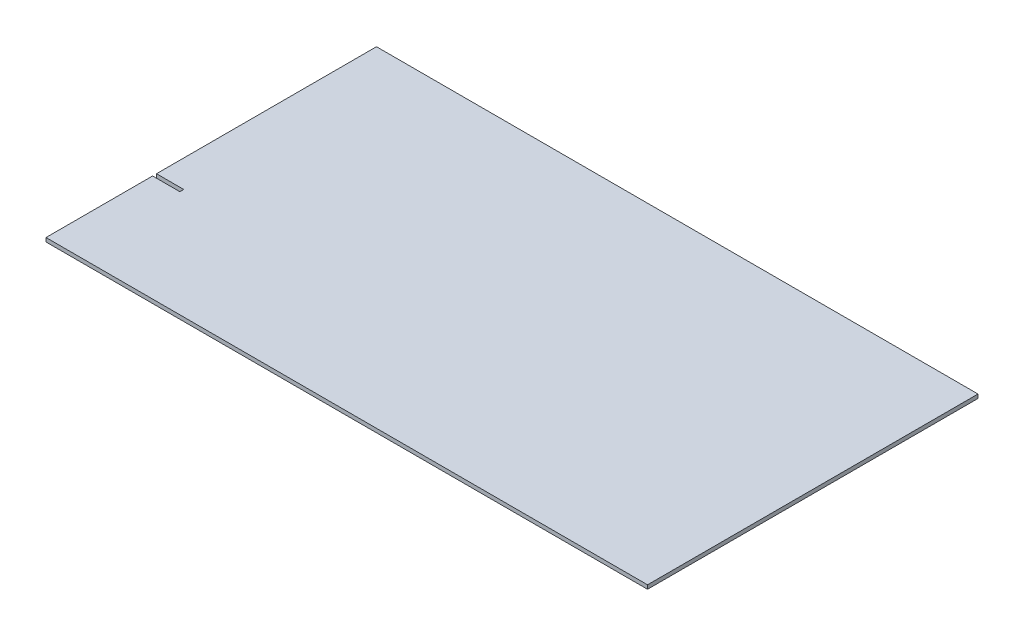
ISO-10303-21;
HEADER;
FILE_DESCRIPTION(('STEP AP214'),'2;1');
FILE_NAME('part.step','',(''),(''),'','','');
FILE_SCHEMA(('AUTOMOTIVE_DESIGN { 1 0 10303 214 1 1 1 1 }'));
ENDSEC;
DATA;
#1=APPLICATION_CONTEXT('core data for automotive mechanical design processes');
#2=APPLICATION_PROTOCOL_DEFINITION('international standard','automotive_design',2000,#1);
#3=PRODUCT_CONTEXT('',#1,'mechanical');
#4=PRODUCT('Part','Part','',(#3));
#5=PRODUCT_RELATED_PRODUCT_CATEGORY('part','',(#4));
#6=PRODUCT_DEFINITION_FORMATION('','',#4);
#7=PRODUCT_DEFINITION_CONTEXT('part definition',#1,'design');
#8=PRODUCT_DEFINITION('design','',#6,#7);
#9=PRODUCT_DEFINITION_SHAPE('','',#8);
#10=(LENGTH_UNIT() NAMED_UNIT(*) SI_UNIT(.MILLI.,.METRE.));
#11=(NAMED_UNIT(*) PLANE_ANGLE_UNIT() SI_UNIT($,.RADIAN.));
#12=(NAMED_UNIT(*) SI_UNIT($,.STERADIAN.) SOLID_ANGLE_UNIT());
#13=UNCERTAINTY_MEASURE_WITH_UNIT(LENGTH_MEASURE(1.E-05),#10,'distance_accuracy_value','');
#14=(GEOMETRIC_REPRESENTATION_CONTEXT(3) GLOBAL_UNCERTAINTY_ASSIGNED_CONTEXT((#13)) GLOBAL_UNIT_ASSIGNED_CONTEXT((#10,
#11,#12)) REPRESENTATION_CONTEXT('',''));
#15=CARTESIAN_POINT('',(0.,0.,0.));
#16=DIRECTION('',(0.,0.,1.));
#17=DIRECTION('',(1.,0.,0.));
#18=AXIS2_PLACEMENT_3D('',#15,#16,#17);
#19=CARTESIAN_POINT('',(0.,2.,0.));
#20=DIRECTION('',(1.,0.,0.));
#21=DIRECTION('',(0.,0.,-1.));
#22=AXIS2_PLACEMENT_3D('',#19,#20,#21);
#23=PLANE('',#22);
#24=DIRECTION('',(0.,0.,1.));
#25=VECTOR('',#24,1.);
#26=CARTESIAN_POINT('',(0.,0.,0.));
#27=LINE('',#26,#25);
#28=CARTESIAN_POINT('',(0.,0.,-169.76));
#29=VERTEX_POINT('',#28);
#30=CARTESIAN_POINT('',(0.,0.,-56.76));
#31=VERTEX_POINT('',#30);
#32=EDGE_CURVE('E135',#29,#31,#27,.T.);
#33=ORIENTED_EDGE('',*,*,#32,.T.);
#34=DIRECTION('',(0.,1.,0.));
#35=VECTOR('',#34,1.);
#36=CARTESIAN_POINT('',(0.,-8.,-56.76));
#37=LINE('',#36,#35);
#38=CARTESIAN_POINT('',(0.,2.,-56.76));
#39=VERTEX_POINT('',#38);
#40=EDGE_CURVE('E159',#31,#39,#37,.T.);
#41=ORIENTED_EDGE('',*,*,#40,.T.);
#42=DIRECTION('',(0.,0.,1.));
#43=VECTOR('',#42,1.);
#44=CARTESIAN_POINT('',(0.,2.,0.));
#45=LINE('',#44,#43);
#46=CARTESIAN_POINT('',(0.,2.,-169.76));
#47=VERTEX_POINT('',#46);
#48=EDGE_CURVE('E123',#47,#39,#45,.T.);
#49=ORIENTED_EDGE('',*,*,#48,.F.);
#50=DIRECTION('',(0.,-1.,0.));
#51=VECTOR('',#50,1.);
#52=CARTESIAN_POINT('',(0.,2.,-169.76));
#53=LINE('',#52,#51);
#54=EDGE_CURVE('E134',#47,#29,#53,.T.);
#55=ORIENTED_EDGE('',*,*,#54,.T.);
#56=EDGE_LOOP('',(#33,#41,#49,#55));
#57=FACE_BOUND('',#56,.T.);
#58=ADVANCED_FACE('F33',(#57),#23,.F.);
#59=CARTESIAN_POINT('',(0.,2.,-54.76));
#60=VERTEX_POINT('',#59);
#61=CARTESIAN_POINT('',(0.,2.,0.));
#62=VERTEX_POINT('',#61);
#63=EDGE_CURVE('E85',#60,#62,#45,.T.);
#64=ORIENTED_EDGE('',*,*,#63,.F.);
#65=DIRECTION('',(0.,1.,0.));
#66=VECTOR('',#65,1.);
#67=CARTESIAN_POINT('',(0.,-8.,-54.76));
#68=LINE('',#67,#66);
#69=CARTESIAN_POINT('',(0.,0.,-54.76));
#70=VERTEX_POINT('',#69);
#71=EDGE_CURVE('E105',#70,#60,#68,.T.);
#72=ORIENTED_EDGE('',*,*,#71,.F.);
#73=CARTESIAN_POINT('',(0.,0.,0.));
#74=VERTEX_POINT('',#73);
#75=EDGE_CURVE('E139',#70,#74,#27,.T.);
#76=ORIENTED_EDGE('',*,*,#75,.T.);
#77=DIRECTION('',(0.,-1.,0.));
#78=VECTOR('',#77,1.);
#79=CARTESIAN_POINT('',(0.,2.,0.));
#80=LINE('',#79,#78);
#81=EDGE_CURVE('E122',#62,#74,#80,.T.);
#82=ORIENTED_EDGE('',*,*,#81,.F.);
#83=EDGE_LOOP('',(#64,#72,#76,#82));
#84=FACE_BOUND('',#83,.T.);
#85=ADVANCED_FACE('F35',(#84),#23,.F.);
#86=CARTESIAN_POINT('',(0.,2.,0.));
#87=DIRECTION('',(0.,0.,-1.));
#88=DIRECTION('',(-1.,0.,0.));
#89=AXIS2_PLACEMENT_3D('',#86,#87,#88);
#90=PLANE('',#89);
#91=DIRECTION('',(1.,0.,0.));
#92=VECTOR('',#91,1.);
#93=CARTESIAN_POINT('',(0.,0.,0.));
#94=LINE('',#93,#92);
#95=CARTESIAN_POINT('',(309.,0.,0.));
#96=VERTEX_POINT('',#95);
#97=EDGE_CURVE('E138',#74,#96,#94,.T.);
#98=ORIENTED_EDGE('',*,*,#97,.T.);
#99=DIRECTION('',(0.,-1.,0.));
#100=VECTOR('',#99,1.);
#101=CARTESIAN_POINT('',(309.,2.,0.));
#102=LINE('',#101,#100);
#103=CARTESIAN_POINT('',(309.,2.,0.));
#104=VERTEX_POINT('',#103);
#105=EDGE_CURVE('E145',#104,#96,#102,.T.);
#106=ORIENTED_EDGE('',*,*,#105,.F.);
#107=DIRECTION('',(1.,0.,0.));
#108=VECTOR('',#107,1.);
#109=CARTESIAN_POINT('',(0.,2.,0.));
#110=LINE('',#109,#108);
#111=EDGE_CURVE('E125',#62,#104,#110,.T.);
#112=ORIENTED_EDGE('',*,*,#111,.F.);
#113=ORIENTED_EDGE('',*,*,#81,.T.);
#114=EDGE_LOOP('',(#98,#106,#112,#113));
#115=FACE_BOUND('',#114,.T.);
#116=ADVANCED_FACE('F177',(#115),#90,.F.);
#117=CARTESIAN_POINT('',(309.,2.,-169.76));
#118=DIRECTION('',(-1.,0.,0.));
#119=DIRECTION('',(0.,0.,1.));
#120=AXIS2_PLACEMENT_3D('',#117,#118,#119);
#121=PLANE('',#120);
#122=DIRECTION('',(0.,0.,-1.));
#123=VECTOR('',#122,1.);
#124=CARTESIAN_POINT('',(309.,0.,-169.76));
#125=LINE('',#124,#123);
#126=CARTESIAN_POINT('',(309.,0.,-169.76));
#127=VERTEX_POINT('',#126);
#128=EDGE_CURVE('E126',#96,#127,#125,.T.);
#129=ORIENTED_EDGE('',*,*,#128,.T.);
#130=DIRECTION('',(0.,-1.,0.));
#131=VECTOR('',#130,1.);
#132=CARTESIAN_POINT('',(309.,2.,-169.76));
#133=LINE('',#132,#131);
#134=CARTESIAN_POINT('',(309.,2.,-169.76));
#135=VERTEX_POINT('',#134);
#136=EDGE_CURVE('E143',#135,#127,#133,.T.);
#137=ORIENTED_EDGE('',*,*,#136,.F.);
#138=DIRECTION('',(0.,0.,-1.));
#139=VECTOR('',#138,1.);
#140=CARTESIAN_POINT('',(309.,2.,-169.76));
#141=LINE('',#140,#139);
#142=EDGE_CURVE('E131',#104,#135,#141,.T.);
#143=ORIENTED_EDGE('',*,*,#142,.F.);
#144=ORIENTED_EDGE('',*,*,#105,.T.);
#145=EDGE_LOOP('',(#129,#137,#143,#144));
#146=FACE_BOUND('',#145,.T.);
#147=ADVANCED_FACE('F174',(#146),#121,.F.);
#148=CARTESIAN_POINT('',(0.,2.,-169.76));
#149=DIRECTION('',(0.,0.,1.));
#150=DIRECTION('',(1.,0.,0.));
#151=AXIS2_PLACEMENT_3D('',#148,#149,#150);
#152=PLANE('',#151);
#153=DIRECTION('',(-1.,0.,0.));
#154=VECTOR('',#153,1.);
#155=CARTESIAN_POINT('',(0.,0.,-169.76));
#156=LINE('',#155,#154);
#157=EDGE_CURVE('E78',#127,#29,#156,.T.);
#158=ORIENTED_EDGE('',*,*,#157,.T.);
#159=ORIENTED_EDGE('',*,*,#54,.F.);
#160=DIRECTION('',(-1.,0.,0.));
#161=VECTOR('',#160,1.);
#162=CARTESIAN_POINT('',(0.,2.,-169.76));
#163=LINE('',#162,#161);
#164=EDGE_CURVE('E57',#135,#47,#163,.T.);
#165=ORIENTED_EDGE('',*,*,#164,.F.);
#166=ORIENTED_EDGE('',*,*,#136,.T.);
#167=EDGE_LOOP('',(#158,#159,#165,#166));
#168=FACE_BOUND('',#167,.T.);
#169=ADVANCED_FACE('F170',(#168),#152,.F.);
#170=CARTESIAN_POINT('',(0.,2.,0.));
#171=DIRECTION('',(0.,-1.,0.));
#172=DIRECTION('',(0.,0.,-1.));
#173=AXIS2_PLACEMENT_3D('',#170,#171,#172);
#174=PLANE('',#173);
#175=ORIENTED_EDGE('',*,*,#48,.T.);
#176=DIRECTION('',(-1.,0.,0.));
#177=VECTOR('',#176,1.);
#178=CARTESIAN_POINT('',(0.,2.,-56.76));
#179=LINE('',#178,#177);
#180=CARTESIAN_POINT('',(14.,2.,-56.76));
#181=VERTEX_POINT('',#180);
#182=EDGE_CURVE('E113',#181,#39,#179,.T.);
#183=ORIENTED_EDGE('',*,*,#182,.F.);
#184=DIRECTION('',(0.,0.,-1.));
#185=VECTOR('',#184,1.);
#186=CARTESIAN_POINT('',(14.,2.,-56.76));
#187=LINE('',#186,#185);
#188=CARTESIAN_POINT('',(14.,2.,-54.76));
#189=VERTEX_POINT('',#188);
#190=EDGE_CURVE('E118',#189,#181,#187,.T.);
#191=ORIENTED_EDGE('',*,*,#190,.F.);
#192=DIRECTION('',(1.,0.,0.));
#193=VECTOR('',#192,1.);
#194=CARTESIAN_POINT('',(0.,2.,-54.76));
#195=LINE('',#194,#193);
#196=EDGE_CURVE('E107',#60,#189,#195,.T.);
#197=ORIENTED_EDGE('',*,*,#196,.F.);
#198=ORIENTED_EDGE('',*,*,#63,.T.);
#199=ORIENTED_EDGE('',*,*,#111,.T.);
#200=ORIENTED_EDGE('',*,*,#142,.T.);
#201=ORIENTED_EDGE('',*,*,#164,.T.);
#202=EDGE_LOOP('',(#175,#183,#191,#197,#198,#199,#200,#201));
#203=FACE_BOUND('',#202,.T.);
#204=ADVANCED_FACE('F115',(#203),#174,.F.);
#205=CARTESIAN_POINT('',(0.,0.,0.));
#206=DIRECTION('',(0.,-1.,0.));
#207=DIRECTION('',(0.,0.,-1.));
#208=AXIS2_PLACEMENT_3D('',#205,#206,#207);
#209=PLANE('',#208);
#210=DIRECTION('',(1.,0.,0.));
#211=VECTOR('',#210,1.);
#212=CARTESIAN_POINT('',(0.,0.,-56.76));
#213=LINE('',#212,#211);
#214=CARTESIAN_POINT('',(14.,0.,-56.76));
#215=VERTEX_POINT('',#214);
#216=EDGE_CURVE('E11',#31,#215,#213,.T.);
#217=ORIENTED_EDGE('',*,*,#216,.F.);
#218=ORIENTED_EDGE('',*,*,#32,.F.);
#219=ORIENTED_EDGE('',*,*,#157,.F.);
#220=ORIENTED_EDGE('',*,*,#128,.F.);
#221=ORIENTED_EDGE('',*,*,#97,.F.);
#222=ORIENTED_EDGE('',*,*,#75,.F.);
#223=DIRECTION('',(-1.,0.,0.));
#224=VECTOR('',#223,1.);
#225=CARTESIAN_POINT('',(0.,0.,-54.76));
#226=LINE('',#225,#224);
#227=CARTESIAN_POINT('',(14.,0.,-54.76));
#228=VERTEX_POINT('',#227);
#229=EDGE_CURVE('E110',#228,#70,#226,.T.);
#230=ORIENTED_EDGE('',*,*,#229,.F.);
#231=DIRECTION('',(0.,0.,1.));
#232=VECTOR('',#231,1.);
#233=CARTESIAN_POINT('',(14.,0.,0.));
#234=LINE('',#233,#232);
#235=EDGE_CURVE('E41',#215,#228,#234,.T.);
#236=ORIENTED_EDGE('',*,*,#235,.F.);
#237=EDGE_LOOP('',(#217,#218,#219,#220,#221,#222,#230,#236));
#238=FACE_BOUND('',#237,.T.);
#239=ADVANCED_FACE('F156',(#238),#209,.T.);
#240=CARTESIAN_POINT('',(0.,-8.,-56.76));
#241=DIRECTION('',(0.,0.,-1.));
#242=DIRECTION('',(-1.,0.,0.));
#243=AXIS2_PLACEMENT_3D('',#240,#241,#242);
#244=PLANE('',#243);
#245=ORIENTED_EDGE('',*,*,#216,.T.);
#246=DIRECTION('',(0.,1.,0.));
#247=VECTOR('',#246,1.);
#248=CARTESIAN_POINT('',(14.,-8.,-56.76));
#249=LINE('',#248,#247);
#250=EDGE_CURVE('E153',#215,#181,#249,.T.);
#251=ORIENTED_EDGE('',*,*,#250,.T.);
#252=ORIENTED_EDGE('',*,*,#182,.T.);
#253=ORIENTED_EDGE('',*,*,#40,.F.);
#254=EDGE_LOOP('',(#245,#251,#252,#253));
#255=FACE_BOUND('',#254,.T.);
#256=ADVANCED_FACE('F168',(#255),#244,.F.);
#257=CARTESIAN_POINT('',(14.,-8.,-56.76));
#258=DIRECTION('',(1.,0.,0.));
#259=DIRECTION('',(0.,0.,-1.));
#260=AXIS2_PLACEMENT_3D('',#257,#258,#259);
#261=PLANE('',#260);
#262=ORIENTED_EDGE('',*,*,#235,.T.);
#263=DIRECTION('',(0.,1.,0.));
#264=VECTOR('',#263,1.);
#265=CARTESIAN_POINT('',(14.,-8.,-54.76));
#266=LINE('',#265,#264);
#267=EDGE_CURVE('E48',#228,#189,#266,.T.);
#268=ORIENTED_EDGE('',*,*,#267,.T.);
#269=ORIENTED_EDGE('',*,*,#190,.T.);
#270=ORIENTED_EDGE('',*,*,#250,.F.);
#271=EDGE_LOOP('',(#262,#268,#269,#270));
#272=FACE_BOUND('',#271,.T.);
#273=ADVANCED_FACE('F152',(#272),#261,.F.);
#274=CARTESIAN_POINT('',(0.,-8.,-54.76));
#275=DIRECTION('',(0.,0.,1.));
#276=DIRECTION('',(1.,0.,0.));
#277=AXIS2_PLACEMENT_3D('',#274,#275,#276);
#278=PLANE('',#277);
#279=ORIENTED_EDGE('',*,*,#229,.T.);
#280=ORIENTED_EDGE('',*,*,#71,.T.);
#281=ORIENTED_EDGE('',*,*,#196,.T.);
#282=ORIENTED_EDGE('',*,*,#267,.F.);
#283=EDGE_LOOP('',(#279,#280,#281,#282));
#284=FACE_BOUND('',#283,.T.);
#285=ADVANCED_FACE('F106',(#284),#278,.F.);
#286=CLOSED_SHELL('',(#58,#85,#116,#147,#169,#204,#239,#256,#273,#285));
#287=MANIFOLD_SOLID_BREP('B2',#286);
#288=ADVANCED_BREP_SHAPE_REPRESENTATION('',(#18,#287),#14);
#289=SHAPE_DEFINITION_REPRESENTATION(#9,#288);
ENDSEC;
END-ISO-10303-21;
